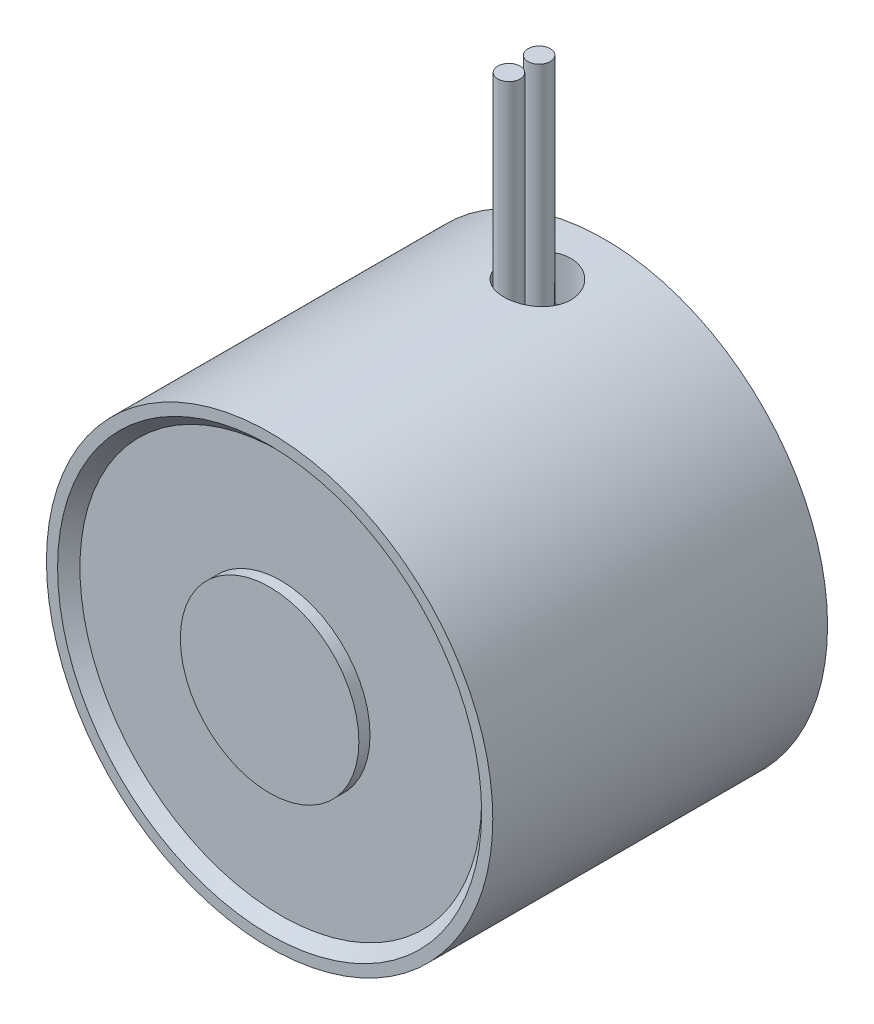
ISO-10303-21;
HEADER;
FILE_DESCRIPTION(('STEP AP214'),'2;1');
FILE_NAME('part.step','',(''),(''),'','','');
FILE_SCHEMA(('AUTOMOTIVE_DESIGN { 1 0 10303 214 1 1 1 1 }'));
ENDSEC;
DATA;
#1=APPLICATION_CONTEXT('core data for automotive mechanical design processes');
#2=APPLICATION_PROTOCOL_DEFINITION('international standard','automotive_design',2000,#1);
#3=PRODUCT_CONTEXT('',#1,'mechanical');
#4=PRODUCT('Part','Part','',(#3));
#5=PRODUCT_RELATED_PRODUCT_CATEGORY('part','',(#4));
#6=PRODUCT_DEFINITION_FORMATION('','',#4);
#7=PRODUCT_DEFINITION_CONTEXT('part definition',#1,'design');
#8=PRODUCT_DEFINITION('design','',#6,#7);
#9=PRODUCT_DEFINITION_SHAPE('','',#8);
#10=(LENGTH_UNIT() NAMED_UNIT(*) SI_UNIT(.MILLI.,.METRE.));
#11=(NAMED_UNIT(*) PLANE_ANGLE_UNIT() SI_UNIT($,.RADIAN.));
#12=(NAMED_UNIT(*) SI_UNIT($,.STERADIAN.) SOLID_ANGLE_UNIT());
#13=UNCERTAINTY_MEASURE_WITH_UNIT(LENGTH_MEASURE(1.E-05),#10,'distance_accuracy_value','');
#14=(GEOMETRIC_REPRESENTATION_CONTEXT(3) GLOBAL_UNCERTAINTY_ASSIGNED_CONTEXT((#13)) GLOBAL_UNIT_ASSIGNED_CONTEXT((#10,
#11,#12)) REPRESENTATION_CONTEXT('',''));
#15=CARTESIAN_POINT('',(0.,0.,0.));
#16=DIRECTION('',(0.,0.,1.));
#17=DIRECTION('',(1.,0.,0.));
#18=AXIS2_PLACEMENT_3D('',#15,#16,#17);
#19=CARTESIAN_POINT('',(0.,0.,15.));
#20=DIRECTION('',(0.,0.,-1.));
#21=DIRECTION('',(-1.,0.,0.));
#22=AXIS2_PLACEMENT_3D('',#19,#20,#21);
#23=CYLINDRICAL_SURFACE('',#22,10.);
#24=CARTESIAN_POINT('',(0.,0.,15.));
#25=DIRECTION('',(0.,0.,1.));
#26=DIRECTION('',(1.,0.,0.));
#27=AXIS2_PLACEMENT_3D('',#24,#25,#26);
#28=CIRCLE('',#27,10.);
#29=CARTESIAN_POINT('',(10.,0.,15.));
#30=VERTEX_POINT('',#29);
#31=EDGE_CURVE('E62',#30,#30,#28,.T.);
#32=ORIENTED_EDGE('',*,*,#31,.F.);
#33=EDGE_LOOP('',(#32));
#34=FACE_BOUND('',#33,.T.);
#35=CARTESIAN_POINT('',(0.,0.,0.));
#36=DIRECTION('',(0.,0.,1.));
#37=DIRECTION('',(1.,0.,0.));
#38=AXIS2_PLACEMENT_3D('',#35,#36,#37);
#39=CIRCLE('',#38,10.);
#40=CARTESIAN_POINT('',(10.,0.,0.));
#41=VERTEX_POINT('',#40);
#42=EDGE_CURVE('E63',#41,#41,#39,.T.);
#43=ORIENTED_EDGE('',*,*,#42,.T.);
#44=EDGE_LOOP('',(#43));
#45=FACE_BOUND('',#44,.T.);
#46=CARTESIAN_POINT('',(0.,10.,1.5));
#47=CARTESIAN_POINT('',(-0.0837515444816421,9.99999865771297,1.50000345381524));
#48=CARTESIAN_POINT('',(-0.167551685082132,9.9989368253704,1.50703800084063));
#49=CARTESIAN_POINT('',(-0.332809627994913,9.99480315973187,1.53498319998275));
#50=CARTESIAN_POINT('',(-0.414265068974229,9.99172936938473,1.55590736294489));
#51=CARTESIAN_POINT('',(-0.57241808622186,9.98391721219526,1.61099250496762));
#52=CARTESIAN_POINT('',(-0.649119207826798,9.97918010370919,1.64514347950595));
#53=CARTESIAN_POINT('',(-0.795690428635254,9.96856475911724,1.72568837941686));
#54=CARTESIAN_POINT('',(-0.865561474725188,9.96268668152773,1.77208060441736));
#55=CARTESIAN_POINT('',(-0.997046719562126,9.95039170991452,1.87617726493987));
#56=CARTESIAN_POINT('',(-1.0585998322255,9.94397133890331,1.9339584562082));
#57=CARTESIAN_POINT('',(-1.17117490668948,9.93134261133238,2.05902768889387));
#58=CARTESIAN_POINT('',(-1.22219626272936,9.92513426698505,2.12631627677852));
#59=CARTESIAN_POINT('',(-1.31249729499943,9.91359877458726,2.26890064352249));
#60=CARTESIAN_POINT('',(-1.35171787037205,9.90827611975031,2.34423424698134));
#61=CARTESIAN_POINT('',(-1.41692632171056,9.89916211306268,2.50051282064543));
#62=CARTESIAN_POINT('',(-1.44291491889163,9.89537067775449,2.58145748474389));
#63=CARTESIAN_POINT('',(-1.48073198798911,9.88978256218673,2.74601804187171));
#64=CARTESIAN_POINT('',(-1.49266503640518,9.8879711574125,2.82960939340802));
#65=CARTESIAN_POINT('',(-1.50235624033932,9.88650348970582,2.99762616598728));
#66=CARTESIAN_POINT('',(-1.50011520973796,9.88684710303147,3.08205153886249));
#67=CARTESIAN_POINT('',(-1.48160733250788,9.88963718352409,3.24860108019414));
#68=CARTESIAN_POINT('',(-1.4654569592775,9.89206618761549,3.3307385264848));
#69=CARTESIAN_POINT('',(-1.41977117403734,9.89872608126367,3.49112436887153));
#70=CARTESIAN_POINT('',(-1.39023538337812,9.90295702179379,3.56937265488074));
#71=CARTESIAN_POINT('',(-1.31849603529736,9.91276335545481,3.72011337128286));
#72=CARTESIAN_POINT('',(-1.27624314283198,9.91834396766526,3.79258196909239));
#73=CARTESIAN_POINT('',(-1.18030413128955,9.93021707574548,3.92944459578193));
#74=CARTESIAN_POINT('',(-1.12661726182478,9.93650961832501,3.99383809426937));
#75=CARTESIAN_POINT('',(-1.00869493078248,9.94917473056209,4.11339766073972));
#76=CARTESIAN_POINT('',(-0.944359329642002,9.95554747112815,4.16846499028634));
#77=CARTESIAN_POINT('',(-0.807307089894186,9.96759647648462,4.26703593450726));
#78=CARTESIAN_POINT('',(-0.73459041458817,9.9732727382251,4.3105394985439));
#79=CARTESIAN_POINT('',(-0.582754598213686,9.98329515585393,4.38475308649955));
#80=CARTESIAN_POINT('',(-0.50363167783678,9.98764051925428,4.4154554918403));
#81=CARTESIAN_POINT('',(-0.34127318248706,9.99450490557069,4.46310938968537));
#82=CARTESIAN_POINT('',(-0.2580378859526,9.99702405195467,4.48006181181558));
#83=CARTESIAN_POINT('',(-0.0906695676436467,9.99993581133871,4.4996032298167));
#84=CARTESIAN_POINT('',(-0.00655273187047093,10.0003485209039,4.50232797137932));
#85=CARTESIAN_POINT('',(0.160936677662282,9.99905561015226,4.49369699468898));
#86=CARTESIAN_POINT('',(0.244309274381877,9.99735005541369,4.4823417123319));
#87=CARTESIAN_POINT('',(0.407532387431408,9.99202468615333,4.44598589982246));
#88=CARTESIAN_POINT('',(0.487397963079837,9.98841415207984,4.42105150396915));
#89=CARTESIAN_POINT('',(0.641814958642999,9.97968235658369,4.35831500253824));
#90=CARTESIAN_POINT('',(0.716366128795099,9.97456102421565,4.32051229266637));
#91=CARTESIAN_POINT('',(0.858634979291921,9.96332682468686,4.23279377543614));
#92=CARTESIAN_POINT('',(0.926299009891565,9.95720701626745,4.18279185998723));
#93=CARTESIAN_POINT('',(1.05232367317771,9.94467863012165,4.07221418837126));
#94=CARTESIAN_POINT('',(1.1106837647934,9.93827003562867,4.01163781767535));
#95=CARTESIAN_POINT('',(1.21693784957195,9.92582264304494,3.88102646682351));
#96=CARTESIAN_POINT('',(1.26474084747421,9.91978736017588,3.81091707480523));
#97=CARTESIAN_POINT('',(1.34789129270584,9.90883219104903,3.66358395948823));
#98=CARTESIAN_POINT('',(1.38323907656436,9.90391227465628,3.58636042847854));
#99=CARTESIAN_POINT('',(1.44033467323943,9.89577033008645,3.42726246637687));
#100=CARTESIAN_POINT('',(1.46213037141635,9.89254233006438,3.34540553902876));
#101=CARTESIAN_POINT('',(1.49165549501586,9.88813382297802,3.17914098456489));
#102=CARTESIAN_POINT('',(1.49938589183066,9.88695317451771,3.09473353400533));
#103=CARTESIAN_POINT('',(1.5005378666944,9.88677832610841,2.92667093668422));
#104=CARTESIAN_POINT('',(1.49410252167313,9.88776226333502,2.84301675824308));
#105=CARTESIAN_POINT('',(1.46741229544379,9.89175820611174,2.67799473667648));
#106=CARTESIAN_POINT('',(1.44715743638627,9.89477020841118,2.59662688988661));
#107=CARTESIAN_POINT('',(1.39345373518665,9.90247526112297,2.43852691776568));
#108=CARTESIAN_POINT('',(1.36001489324314,9.90716703716075,2.36179132956656));
#109=CARTESIAN_POINT('',(1.28090667642309,9.91770454557702,2.2149963661976));
#110=CARTESIAN_POINT('',(1.23523688741502,9.92355031702724,2.14493721719636));
#111=CARTESIAN_POINT('',(1.13244337659164,9.93580743364938,2.01275694202483));
#112=CARTESIAN_POINT('',(1.07521369039806,9.94222367881967,1.95071866675293));
#113=CARTESIAN_POINT('',(0.951148841082835,9.95485788826636,1.83707544521218));
#114=CARTESIAN_POINT('',(0.884311448350941,9.96107580610759,1.78547292742384));
#115=CARTESIAN_POINT('',(0.742495707543722,9.9726518579052,1.69391232339264));
#116=CARTESIAN_POINT('',(0.66747457676476,9.9780050712882,1.65401989078525));
#117=CARTESIAN_POINT('',(0.511751870248719,9.98720028802959,1.58746148324195));
#118=CARTESIAN_POINT('',(0.431056277096704,9.99104385565757,1.56078180994631));
#119=CARTESIAN_POINT('',(0.291665727889329,9.99590939261505,1.52745865728989));
#120=CARTESIAN_POINT('',(0.233831133495278,9.99743549179557,1.51717739846119));
#121=CARTESIAN_POINT('',(0.117338971600125,9.99948125947896,1.50344690228736));
#122=CARTESIAN_POINT('',(0.0586814143344172,10.0000009404877,1.49999758004745));
#123=CARTESIAN_POINT('',(0.,10.,1.5));
#124=B_SPLINE_CURVE_WITH_KNOTS('',3,(#46,#47,#48,#49,#50,#51,#52,#53,#54,#55,#56,#57,#58,#59,
#60,#61,#62,#63,#64,#65,#66,#67,#68,#69,#70,#71,#72,#73,#74,#75,#76,#77,#78,#79,#80,#81,#82,#83,
#84,#85,#86,#87,#88,#89,#90,#91,#92,#93,#94,#95,#96,#97,#98,#99,#100,#101,#102,#103,#104,#105,
#106,#107,#108,#109,#110,#111,#112,#113,#114,#115,#116,#117,#118,#119,#120,#121,#122,#123),
.UNSPECIFIED.,.T.,.F.,(4,2,2,2,2,2,2,2,2,2,2,2,2,2,2,2,2,2,2,2,2,2,2,2,2,2,2,2,2,2,2,2,2,2,2,2,
2,2,4),(0.,0.251040205031663,0.50232496292915,0.753420023583237,1.0044802241976,
1.25729416136843,1.5101226357258,1.76419702395375,2.01825756225506,2.27041564605924,
2.52255925098982,2.77261177195746,3.02267136690361,3.27371383476159,3.52477278308534,
3.77834291255408,4.03191415238668,4.28563608984874,4.53934087193401,4.79062058544255,
5.04189251991155,5.29195148965948,5.54202220376273,5.79391188036907,6.04581620028629,
6.29981366584671,6.55380426808832,6.80689223457168,7.05996272137176,7.31048888261064,
7.56101464229564,7.81135073984146,8.06169531466879,8.31444829965721,8.56726003468733,
8.82146323384733,9.07540233261441,9.25129851978808,9.42719252123291),.UNSPECIFIED.);
#125=CARTESIAN_POINT('',(0.,10.,1.5));
#126=VERTEX_POINT('',#125);
#127=EDGE_CURVE('E41',#126,#126,#124,.T.);
#128=ORIENTED_EDGE('',*,*,#127,.F.);
#129=EDGE_LOOP('',(#128));
#130=FACE_BOUND('',#129,.T.);
#131=ADVANCED_FACE('F37',(#34,#45,#130),#23,.T.);
#132=CARTESIAN_POINT('',(0.,0.,15.));
#133=DIRECTION('',(0.,0.,1.));
#134=DIRECTION('',(1.,0.,0.));
#135=AXIS2_PLACEMENT_3D('',#132,#133,#134);
#136=PLANE('',#135);
#137=CARTESIAN_POINT('',(0.,0.,15.));
#138=DIRECTION('',(0.,0.,1.));
#139=DIRECTION('',(1.,0.,0.));
#140=AXIS2_PLACEMENT_3D('',#137,#138,#139);
#141=CIRCLE('',#140,9.5);
#142=CARTESIAN_POINT('',(9.5,0.,15.));
#143=VERTEX_POINT('',#142);
#144=EDGE_CURVE('E56',#143,#143,#141,.F.);
#145=ORIENTED_EDGE('',*,*,#144,.T.);
#146=EDGE_LOOP('',(#145));
#147=FACE_BOUND('',#146,.T.);
#148=ORIENTED_EDGE('',*,*,#31,.T.);
#149=EDGE_LOOP('',(#148));
#150=FACE_BOUND('',#149,.T.);
#151=ADVANCED_FACE('F133',(#147,#150),#136,.T.);
#152=CARTESIAN_POINT('',(0.,0.,0.));
#153=DIRECTION('',(0.,0.,1.));
#154=DIRECTION('',(1.,0.,0.));
#155=AXIS2_PLACEMENT_3D('',#152,#153,#154);
#156=PLANE('',#155);
#157=CARTESIAN_POINT('',(0.,0.,0.));
#158=DIRECTION('',(0.,0.,1.));
#159=DIRECTION('',(1.,0.,0.));
#160=AXIS2_PLACEMENT_3D('',#157,#158,#159);
#161=CIRCLE('',#160,1.99999999999999);
#162=CARTESIAN_POINT('',(1.99999999999999,0.,0.));
#163=VERTEX_POINT('',#162);
#164=EDGE_CURVE('E10',#163,#163,#161,.T.);
#165=ORIENTED_EDGE('',*,*,#164,.T.);
#166=EDGE_LOOP('',(#165));
#167=FACE_BOUND('',#166,.T.);
#168=ORIENTED_EDGE('',*,*,#42,.F.);
#169=EDGE_LOOP('',(#168));
#170=FACE_BOUND('',#169,.T.);
#171=ADVANCED_FACE('F138',(#167,#170),#156,.F.);
#172=CARTESIAN_POINT('',(0.,0.,14.5));
#173=DIRECTION('',(0.,0.,1.));
#174=DIRECTION('',(1.,0.,0.));
#175=AXIS2_PLACEMENT_3D('',#172,#173,#174);
#176=PLANE('',#175);
#177=CARTESIAN_POINT('',(0.,0.,14.5));
#178=DIRECTION('',(0.,0.,1.));
#179=DIRECTION('',(1.,0.,0.));
#180=AXIS2_PLACEMENT_3D('',#177,#178,#179);
#181=CIRCLE('',#180,4.);
#182=CARTESIAN_POINT('',(4.,0.,14.5));
#183=VERTEX_POINT('',#182);
#184=EDGE_CURVE('E74',#183,#183,#181,.T.);
#185=ORIENTED_EDGE('',*,*,#184,.F.);
#186=EDGE_LOOP('',(#185));
#187=FACE_BOUND('',#186,.T.);
#188=CARTESIAN_POINT('',(0.,0.,14.5));
#189=DIRECTION('',(0.,0.,1.));
#190=DIRECTION('',(1.,0.,0.));
#191=AXIS2_PLACEMENT_3D('',#188,#189,#190);
#192=CIRCLE('',#191,9.);
#193=CARTESIAN_POINT('',(9.,0.,14.5));
#194=VERTEX_POINT('',#193);
#195=EDGE_CURVE('E67',#194,#194,#192,.T.);
#196=ORIENTED_EDGE('',*,*,#195,.T.);
#197=EDGE_LOOP('',(#196));
#198=FACE_BOUND('',#197,.T.);
#199=ADVANCED_FACE('F163',(#187,#198),#176,.T.);
#200=CARTESIAN_POINT('',(0.,0.,14.5));
#201=DIRECTION('',(0.,0.,1.));
#202=DIRECTION('',(1.,0.,0.));
#203=AXIS2_PLACEMENT_3D('',#200,#201,#202);
#204=CYLINDRICAL_SURFACE('',#203,4.);
#205=ORIENTED_EDGE('',*,*,#184,.T.);
#206=EDGE_LOOP('',(#205));
#207=FACE_BOUND('',#206,.T.);
#208=CARTESIAN_POINT('',(0.,0.,15.));
#209=DIRECTION('',(0.,0.,1.));
#210=DIRECTION('',(1.,0.,0.));
#211=AXIS2_PLACEMENT_3D('',#208,#209,#210);
#212=CIRCLE('',#211,4.);
#213=CARTESIAN_POINT('',(4.,0.,15.));
#214=VERTEX_POINT('',#213);
#215=EDGE_CURVE('E75',#214,#214,#212,.T.);
#216=ORIENTED_EDGE('',*,*,#215,.F.);
#217=EDGE_LOOP('',(#216));
#218=FACE_BOUND('',#217,.T.);
#219=ADVANCED_FACE('F157',(#207,#218),#204,.T.);
#220=ORIENTED_EDGE('',*,*,#215,.T.);
#221=EDGE_LOOP('',(#220));
#222=FACE_BOUND('',#221,.T.);
#223=ADVANCED_FACE('F141',(#222),#136,.T.);
#224=CARTESIAN_POINT('',(0.,0.,14.5));
#225=DIRECTION('',(0.,0.,1.));
#226=DIRECTION('',(1.,0.,0.));
#227=AXIS2_PLACEMENT_3D('',#224,#225,#226);
#228=CONICAL_SURFACE('',#227,9.,0.785398163397452);
#229=ORIENTED_EDGE('',*,*,#144,.F.);
#230=EDGE_LOOP('',(#229));
#231=FACE_BOUND('',#230,.T.);
#232=ORIENTED_EDGE('',*,*,#195,.F.);
#233=EDGE_LOOP('',(#232));
#234=FACE_BOUND('',#233,.T.);
#235=ADVANCED_FACE('F146',(#231,#234),#228,.F.);
#236=CARTESIAN_POINT('',(0.,0.,5.));
#237=DIRECTION('',(0.,0.,-1.));
#238=DIRECTION('',(-1.,0.,0.));
#239=AXIS2_PLACEMENT_3D('',#236,#237,#238);
#240=CYLINDRICAL_SURFACE('',#239,1.5);
#241=CARTESIAN_POINT('',(0.,0.,0.499999999999989));
#242=DIRECTION('',(0.,0.,1.));
#243=DIRECTION('',(1.,0.,0.));
#244=AXIS2_PLACEMENT_3D('',#241,#242,#243);
#245=CIRCLE('',#244,1.5);
#246=CARTESIAN_POINT('',(1.5,0.,0.499999999999989));
#247=VERTEX_POINT('',#246);
#248=EDGE_CURVE('E51',#247,#247,#245,.F.);
#249=ORIENTED_EDGE('',*,*,#248,.T.);
#250=EDGE_LOOP('',(#249));
#251=FACE_BOUND('',#250,.T.);
#252=CARTESIAN_POINT('',(0.,0.,5.));
#253=DIRECTION('',(0.,0.,-1.));
#254=DIRECTION('',(-1.,0.,0.));
#255=AXIS2_PLACEMENT_3D('',#252,#253,#254);
#256=CIRCLE('',#255,1.5);
#257=CARTESIAN_POINT('',(-1.5,0.,5.));
#258=VERTEX_POINT('',#257);
#259=EDGE_CURVE('E79',#258,#258,#256,.T.);
#260=ORIENTED_EDGE('',*,*,#259,.F.);
#261=EDGE_LOOP('',(#260));
#262=FACE_BOUND('',#261,.T.);
#263=ADVANCED_FACE('F148',(#251,#262),#240,.F.);
#264=CARTESIAN_POINT('',(0.,0.,5.));
#265=DIRECTION('',(0.,0.,-1.));
#266=DIRECTION('',(-1.,0.,0.));
#267=AXIS2_PLACEMENT_3D('',#264,#265,#266);
#268=PLANE('',#267);
#269=ORIENTED_EDGE('',*,*,#259,.T.);
#270=EDGE_LOOP('',(#269));
#271=FACE_BOUND('',#270,.T.);
#272=ADVANCED_FACE('F154',(#271),#268,.T.);
#273=CARTESIAN_POINT('',(0.,0.,0.499999999999989));
#274=DIRECTION('',(0.,0.,-1.));
#275=DIRECTION('',(-1.,0.,0.));
#276=AXIS2_PLACEMENT_3D('',#273,#274,#275);
#277=CONICAL_SURFACE('',#276,1.5,0.78539816339745);
#278=ORIENTED_EDGE('',*,*,#164,.F.);
#279=EDGE_LOOP('',(#278));
#280=FACE_BOUND('',#279,.T.);
#281=ORIENTED_EDGE('',*,*,#248,.F.);
#282=EDGE_LOOP('',(#281));
#283=FACE_BOUND('',#282,.T.);
#284=ADVANCED_FACE('F39',(#280,#283),#277,.F.);
#285=CARTESIAN_POINT('',(0.,15.,3.));
#286=DIRECTION('',(0.,-1.,0.));
#287=DIRECTION('',(0.,0.,-1.));
#288=AXIS2_PLACEMENT_3D('',#285,#286,#287);
#289=CYLINDRICAL_SURFACE('',#288,1.5);
#290=CARTESIAN_POINT('',(0.,8.,3.));
#291=DIRECTION('',(0.,1.,0.));
#292=DIRECTION('',(0.,0.,1.));
#293=AXIS2_PLACEMENT_3D('',#290,#291,#292);
#294=CIRCLE('',#293,1.5);
#295=CARTESIAN_POINT('',(0.,8.,4.5));
#296=VERTEX_POINT('',#295);
#297=EDGE_CURVE('E86',#296,#296,#294,.T.);
#298=ORIENTED_EDGE('',*,*,#297,.F.);
#299=EDGE_LOOP('',(#298));
#300=FACE_BOUND('',#299,.T.);
#301=ORIENTED_EDGE('',*,*,#127,.T.);
#302=EDGE_LOOP('',(#301));
#303=FACE_BOUND('',#302,.T.);
#304=ADVANCED_FACE('F120',(#300,#303),#289,.F.);
#305=CARTESIAN_POINT('',(0.,8.,3.));
#306=DIRECTION('',(0.,1.,0.));
#307=DIRECTION('',(0.,0.,1.));
#308=AXIS2_PLACEMENT_3D('',#305,#306,#307);
#309=PLANE('',#308);
#310=CARTESIAN_POINT('',(-0.6,8.,3.67477270848675));
#311=DIRECTION('',(0.,1.,0.));
#312=DIRECTION('',(0.,0.,1.));
#313=AXIS2_PLACEMENT_3D('',#310,#311,#312);
#314=CIRCLE('',#313,0.5);
#315=CARTESIAN_POINT('',(-0.6,8.,4.17477270848675));
#316=VERTEX_POINT('',#315);
#317=EDGE_CURVE('E99',#316,#316,#314,.T.);
#318=ORIENTED_EDGE('',*,*,#317,.F.);
#319=EDGE_LOOP('',(#318));
#320=FACE_BOUND('',#319,.T.);
#321=CARTESIAN_POINT('',(-0.6,8.,2.32522729151325));
#322=DIRECTION('',(0.,1.,0.));
#323=DIRECTION('',(0.,0.,1.));
#324=AXIS2_PLACEMENT_3D('',#321,#322,#323);
#325=CIRCLE('',#324,0.5);
#326=CARTESIAN_POINT('',(-0.6,8.,2.82522729151325));
#327=VERTEX_POINT('',#326);
#328=EDGE_CURVE('E91',#327,#327,#325,.T.);
#329=ORIENTED_EDGE('',*,*,#328,.F.);
#330=EDGE_LOOP('',(#329));
#331=FACE_BOUND('',#330,.T.);
#332=ORIENTED_EDGE('',*,*,#297,.T.);
#333=EDGE_LOOP('',(#332));
#334=FACE_BOUND('',#333,.T.);
#335=ADVANCED_FACE('F116',(#320,#331,#334),#309,.T.);
#336=CARTESIAN_POINT('',(-0.6,18.,2.32522729151325));
#337=DIRECTION('',(0.,-1.,0.));
#338=DIRECTION('',(0.,0.,-1.));
#339=AXIS2_PLACEMENT_3D('',#336,#337,#338);
#340=CYLINDRICAL_SURFACE('',#339,0.5);
#341=CARTESIAN_POINT('',(-0.6,18.,2.32522729151325));
#342=DIRECTION('',(0.,1.,0.));
#343=DIRECTION('',(0.,0.,1.));
#344=AXIS2_PLACEMENT_3D('',#341,#342,#343);
#345=CIRCLE('',#344,0.5);
#346=CARTESIAN_POINT('',(-0.6,18.,2.82522729151325));
#347=VERTEX_POINT('',#346);
#348=EDGE_CURVE('E90',#347,#347,#345,.T.);
#349=ORIENTED_EDGE('',*,*,#348,.F.);
#350=EDGE_LOOP('',(#349));
#351=FACE_BOUND('',#350,.T.);
#352=ORIENTED_EDGE('',*,*,#328,.T.);
#353=EDGE_LOOP('',(#352));
#354=FACE_BOUND('',#353,.T.);
#355=ADVANCED_FACE('F119',(#351,#354),#340,.T.);
#356=CARTESIAN_POINT('',(-0.6,18.,2.32522729151325));
#357=DIRECTION('',(0.,1.,0.));
#358=DIRECTION('',(0.,0.,1.));
#359=AXIS2_PLACEMENT_3D('',#356,#357,#358);
#360=PLANE('',#359);
#361=ORIENTED_EDGE('',*,*,#348,.T.);
#362=EDGE_LOOP('',(#361));
#363=FACE_BOUND('',#362,.T.);
#364=ADVANCED_FACE('F112',(#363),#360,.T.);
#365=CARTESIAN_POINT('',(-0.6,18.,3.67477270848675));
#366=DIRECTION('',(0.,-1.,0.));
#367=DIRECTION('',(0.,0.,-1.));
#368=AXIS2_PLACEMENT_3D('',#365,#366,#367);
#369=CYLINDRICAL_SURFACE('',#368,0.5);
#370=CARTESIAN_POINT('',(-0.6,18.,3.67477270848675));
#371=DIRECTION('',(0.,1.,0.));
#372=DIRECTION('',(0.,0.,1.));
#373=AXIS2_PLACEMENT_3D('',#370,#371,#372);
#374=CIRCLE('',#373,0.5);
#375=CARTESIAN_POINT('',(-0.6,18.,4.17477270848675));
#376=VERTEX_POINT('',#375);
#377=EDGE_CURVE('E95',#376,#376,#374,.T.);
#378=ORIENTED_EDGE('',*,*,#377,.F.);
#379=EDGE_LOOP('',(#378));
#380=FACE_BOUND('',#379,.T.);
#381=ORIENTED_EDGE('',*,*,#317,.T.);
#382=EDGE_LOOP('',(#381));
#383=FACE_BOUND('',#382,.T.);
#384=ADVANCED_FACE('F109',(#380,#383),#369,.T.);
#385=CARTESIAN_POINT('',(-0.6,18.,3.67477270848675));
#386=DIRECTION('',(0.,1.,0.));
#387=DIRECTION('',(0.,0.,1.));
#388=AXIS2_PLACEMENT_3D('',#385,#386,#387);
#389=PLANE('',#388);
#390=ORIENTED_EDGE('',*,*,#377,.T.);
#391=EDGE_LOOP('',(#390));
#392=FACE_BOUND('',#391,.T.);
#393=ADVANCED_FACE('F107',(#392),#389,.T.);
#394=CLOSED_SHELL('',(#131,#151,#171,#199,#219,#223,#235,#263,#272,#284,#304,#335,#355,#364,
#384,#393));
#395=MANIFOLD_SOLID_BREP('B2',#394);
#396=ADVANCED_BREP_SHAPE_REPRESENTATION('',(#18,#395),#14);
#397=SHAPE_DEFINITION_REPRESENTATION(#9,#396);
ENDSEC;
END-ISO-10303-21;
